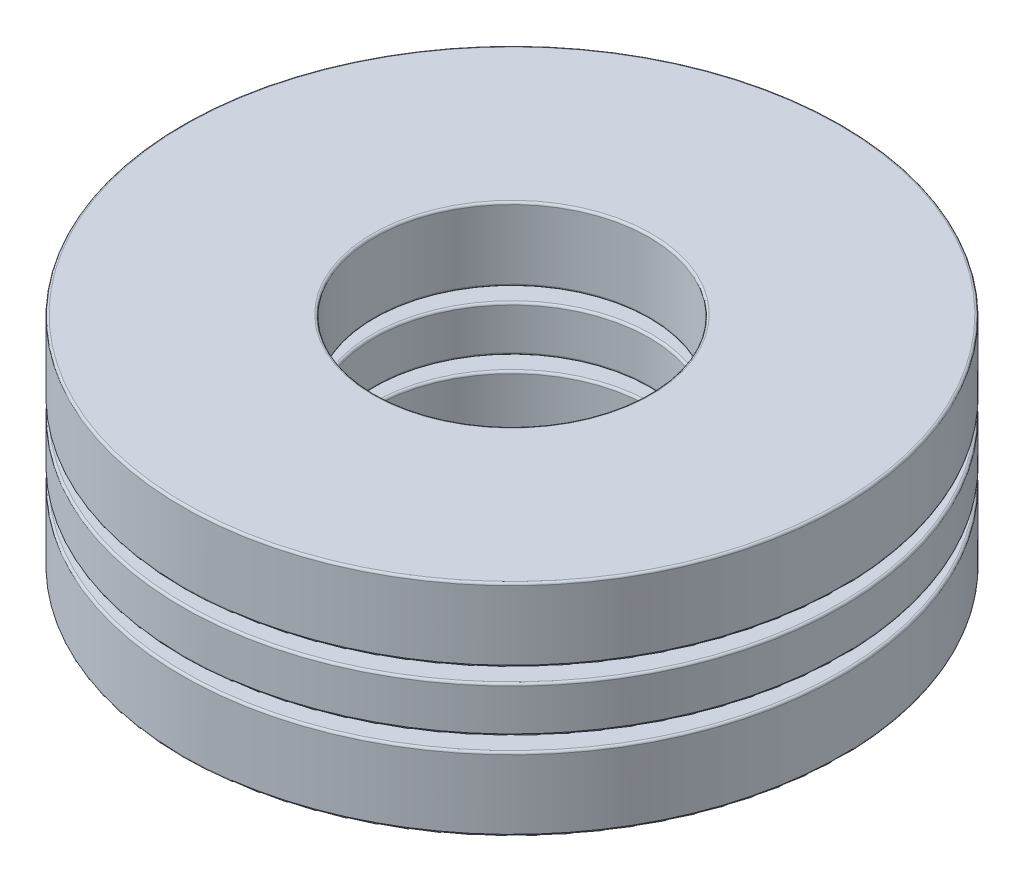
ISO-10303-21;
HEADER;
FILE_DESCRIPTION(('STEP AP214'),'2;1');
FILE_NAME('part.step','',(''),(''),'','','');
FILE_SCHEMA(('AUTOMOTIVE_DESIGN { 1 0 10303 214 1 1 1 1 }'));
ENDSEC;
DATA;
#1=APPLICATION_CONTEXT('core data for automotive mechanical design processes');
#2=APPLICATION_PROTOCOL_DEFINITION('international standard','automotive_design',2000,#1);
#3=PRODUCT_CONTEXT('',#1,'mechanical');
#4=PRODUCT('Part','Part','',(#3));
#5=PRODUCT_RELATED_PRODUCT_CATEGORY('part','',(#4));
#6=PRODUCT_DEFINITION_FORMATION('','',#4);
#7=PRODUCT_DEFINITION_CONTEXT('part definition',#1,'design');
#8=PRODUCT_DEFINITION('design','',#6,#7);
#9=PRODUCT_DEFINITION_SHAPE('','',#8);
#10=(LENGTH_UNIT() NAMED_UNIT(*) SI_UNIT(.MILLI.,.METRE.));
#11=(NAMED_UNIT(*) PLANE_ANGLE_UNIT() SI_UNIT($,.RADIAN.));
#12=(NAMED_UNIT(*) SI_UNIT($,.STERADIAN.) SOLID_ANGLE_UNIT());
#13=UNCERTAINTY_MEASURE_WITH_UNIT(LENGTH_MEASURE(1.E-05),#10,'distance_accuracy_value','');
#14=(GEOMETRIC_REPRESENTATION_CONTEXT(3) GLOBAL_UNCERTAINTY_ASSIGNED_CONTEXT((#13)) GLOBAL_UNIT_ASSIGNED_CONTEXT((#10,
#11,#12)) REPRESENTATION_CONTEXT('',''));
#15=CARTESIAN_POINT('',(0.,0.,0.));
#16=DIRECTION('',(0.,0.,1.));
#17=DIRECTION('',(1.,0.,0.));
#18=AXIS2_PLACEMENT_3D('',#15,#16,#17);
#19=CARTESIAN_POINT('',(0.,-2.,0.));
#20=DIRECTION('',(0.,-1.,0.));
#21=DIRECTION('',(0.,0.,-1.));
#22=AXIS2_PLACEMENT_3D('',#19,#20,#21);
#23=CYLINDRICAL_SURFACE('',#22,6.);
#24=CARTESIAN_POINT('',(0.,-1.96,0.));
#25=DIRECTION('',(0.,1.,0.));
#26=DIRECTION('',(0.,0.,1.));
#27=AXIS2_PLACEMENT_3D('',#24,#25,#26);
#28=CIRCLE('',#27,6.);
#29=CARTESIAN_POINT('',(0.,-1.96,6.));
#30=VERTEX_POINT('',#29);
#31=EDGE_CURVE('E11',#30,#30,#28,.T.);
#32=ORIENTED_EDGE('',*,*,#31,.T.);
#33=EDGE_LOOP('',(#32));
#34=FACE_BOUND('',#33,.T.);
#35=CARTESIAN_POINT('',(0.,-0.706666666666667,0.));
#36=DIRECTION('',(0.,-1.,0.));
#37=DIRECTION('',(0.,0.,-1.));
#38=AXIS2_PLACEMENT_3D('',#35,#36,#37);
#39=CIRCLE('',#38,6.);
#40=CARTESIAN_POINT('',(0.,-0.706666666666667,-6.));
#41=VERTEX_POINT('',#40);
#42=EDGE_CURVE('E50',#41,#41,#39,.T.);
#43=ORIENTED_EDGE('',*,*,#42,.T.);
#44=EDGE_LOOP('',(#43));
#45=FACE_BOUND('',#44,.T.);
#46=ADVANCED_FACE('F43',(#34,#45),#23,.T.);
#47=CARTESIAN_POINT('',(0.,-0.666666666666667,6.));
#48=DIRECTION('',(0.,-1.,0.));
#49=DIRECTION('',(0.,0.,-1.));
#50=AXIS2_PLACEMENT_3D('',#47,#48,#49);
#51=PLANE('',#50);
#52=CARTESIAN_POINT('',(0.,-0.666666666666667,0.));
#53=DIRECTION('',(0.,-1.,0.));
#54=DIRECTION('',(0.,0.,-1.));
#55=AXIS2_PLACEMENT_3D('',#52,#53,#54);
#56=CIRCLE('',#55,2.54);
#57=CARTESIAN_POINT('',(0.,-0.666666666666667,-2.54));
#58=VERTEX_POINT('',#57);
#59=EDGE_CURVE('E54',#58,#58,#56,.T.);
#60=ORIENTED_EDGE('',*,*,#59,.T.);
#61=EDGE_LOOP('',(#60));
#62=FACE_BOUND('',#61,.T.);
#63=CARTESIAN_POINT('',(0.,-0.666666666666667,0.));
#64=DIRECTION('',(0.,-1.,0.));
#65=DIRECTION('',(0.,0.,-1.));
#66=AXIS2_PLACEMENT_3D('',#63,#64,#65);
#67=CIRCLE('',#66,5.96);
#68=CARTESIAN_POINT('',(0.,-0.666666666666667,-5.96));
#69=VERTEX_POINT('',#68);
#70=EDGE_CURVE('E58',#69,#69,#67,.F.);
#71=ORIENTED_EDGE('',*,*,#70,.T.);
#72=EDGE_LOOP('',(#71));
#73=FACE_BOUND('',#72,.T.);
#74=ADVANCED_FACE('F86',(#62,#73),#51,.F.);
#75=CARTESIAN_POINT('',(0.,-2.,0.));
#76=DIRECTION('',(0.,-1.,0.));
#77=DIRECTION('',(0.,0.,-1.));
#78=AXIS2_PLACEMENT_3D('',#75,#76,#77);
#79=CYLINDRICAL_SURFACE('',#78,2.5);
#80=CARTESIAN_POINT('',(0.,-1.96,0.));
#81=DIRECTION('',(0.,1.,0.));
#82=DIRECTION('',(0.,0.,1.));
#83=AXIS2_PLACEMENT_3D('',#80,#81,#82);
#84=CIRCLE('',#83,2.5);
#85=CARTESIAN_POINT('',(0.,-1.96,2.5));
#86=VERTEX_POINT('',#85);
#87=EDGE_CURVE('E69',#86,#86,#84,.F.);
#88=ORIENTED_EDGE('',*,*,#87,.T.);
#89=EDGE_LOOP('',(#88));
#90=FACE_BOUND('',#89,.T.);
#91=CARTESIAN_POINT('',(0.,-0.706666666666667,0.));
#92=DIRECTION('',(0.,-1.,0.));
#93=DIRECTION('',(0.,0.,-1.));
#94=AXIS2_PLACEMENT_3D('',#91,#92,#93);
#95=CIRCLE('',#94,2.5);
#96=CARTESIAN_POINT('',(0.,-0.706666666666667,-2.5));
#97=VERTEX_POINT('',#96);
#98=EDGE_CURVE('E72',#97,#97,#95,.F.);
#99=ORIENTED_EDGE('',*,*,#98,.T.);
#100=EDGE_LOOP('',(#99));
#101=FACE_BOUND('',#100,.T.);
#102=ADVANCED_FACE('F76',(#90,#101),#79,.F.);
#103=CARTESIAN_POINT('',(0.,-2.,6.));
#104=DIRECTION('',(0.,1.,0.));
#105=DIRECTION('',(0.,0.,1.));
#106=AXIS2_PLACEMENT_3D('',#103,#104,#105);
#107=PLANE('',#106);
#108=CARTESIAN_POINT('',(0.,-2.,0.));
#109=DIRECTION('',(0.,1.,0.));
#110=DIRECTION('',(0.,0.,1.));
#111=AXIS2_PLACEMENT_3D('',#108,#109,#110);
#112=CIRCLE('',#111,2.54);
#113=CARTESIAN_POINT('',(0.,-2.,2.54));
#114=VERTEX_POINT('',#113);
#115=EDGE_CURVE('E63',#114,#114,#112,.T.);
#116=ORIENTED_EDGE('',*,*,#115,.T.);
#117=EDGE_LOOP('',(#116));
#118=FACE_BOUND('',#117,.T.);
#119=CARTESIAN_POINT('',(0.,-2.,0.));
#120=DIRECTION('',(0.,1.,0.));
#121=DIRECTION('',(0.,0.,1.));
#122=AXIS2_PLACEMENT_3D('',#119,#120,#121);
#123=CIRCLE('',#122,5.96);
#124=CARTESIAN_POINT('',(0.,-2.,5.96));
#125=VERTEX_POINT('',#124);
#126=EDGE_CURVE('E66',#125,#125,#123,.F.);
#127=ORIENTED_EDGE('',*,*,#126,.T.);
#128=EDGE_LOOP('',(#127));
#129=FACE_BOUND('',#128,.T.);
#130=ADVANCED_FACE('F105',(#118,#129),#107,.F.);
#131=CARTESIAN_POINT('',(0.,-1.96,0.));
#132=DIRECTION('',(0.,1.,0.));
#133=DIRECTION('',(0.,0.,1.));
#134=AXIS2_PLACEMENT_3D('',#131,#132,#133);
#135=TOROIDAL_SURFACE('',#134,2.54,0.04);
#136=ORIENTED_EDGE('',*,*,#115,.F.);
#137=EDGE_LOOP('',(#136));
#138=FACE_BOUND('',#137,.T.);
#139=ORIENTED_EDGE('',*,*,#87,.F.);
#140=EDGE_LOOP('',(#139));
#141=FACE_BOUND('',#140,.T.);
#142=ADVANCED_FACE('F82',(#138,#141),#135,.T.);
#143=CARTESIAN_POINT('',(0.,-0.706666666666667,0.));
#144=DIRECTION('',(0.,-1.,0.));
#145=DIRECTION('',(0.,0.,-1.));
#146=AXIS2_PLACEMENT_3D('',#143,#144,#145);
#147=TOROIDAL_SURFACE('',#146,2.54,0.04);
#148=ORIENTED_EDGE('',*,*,#98,.F.);
#149=EDGE_LOOP('',(#148));
#150=FACE_BOUND('',#149,.T.);
#151=ORIENTED_EDGE('',*,*,#59,.F.);
#152=EDGE_LOOP('',(#151));
#153=FACE_BOUND('',#152,.T.);
#154=ADVANCED_FACE('F78',(#150,#153),#147,.T.);
#155=CARTESIAN_POINT('',(0.,-1.96,0.));
#156=DIRECTION('',(0.,1.,0.));
#157=DIRECTION('',(0.,0.,1.));
#158=AXIS2_PLACEMENT_3D('',#155,#156,#157);
#159=TOROIDAL_SURFACE('',#158,5.96,0.04);
#160=ORIENTED_EDGE('',*,*,#31,.F.);
#161=EDGE_LOOP('',(#160));
#162=FACE_BOUND('',#161,.T.);
#163=ORIENTED_EDGE('',*,*,#126,.F.);
#164=EDGE_LOOP('',(#163));
#165=FACE_BOUND('',#164,.T.);
#166=ADVANCED_FACE('F81',(#162,#165),#159,.T.);
#167=CARTESIAN_POINT('',(0.,-0.706666666666667,0.));
#168=DIRECTION('',(0.,-1.,0.));
#169=DIRECTION('',(0.,0.,-1.));
#170=AXIS2_PLACEMENT_3D('',#167,#168,#169);
#171=TOROIDAL_SURFACE('',#170,5.96,0.04);
#172=ORIENTED_EDGE('',*,*,#70,.F.);
#173=EDGE_LOOP('',(#172));
#174=FACE_BOUND('',#173,.T.);
#175=ORIENTED_EDGE('',*,*,#42,.F.);
#176=EDGE_LOOP('',(#175));
#177=FACE_BOUND('',#176,.T.);
#178=ADVANCED_FACE('F45',(#174,#177),#171,.T.);
#179=CLOSED_SHELL('',(#46,#74,#102,#130,#142,#154,#166,#178));
#180=MANIFOLD_SOLID_BREP('B2',#179);
#181=CARTESIAN_POINT('',(0.,-2.,0.));
#182=DIRECTION('',(0.,-1.,0.));
#183=DIRECTION('',(0.,0.,-1.));
#184=AXIS2_PLACEMENT_3D('',#181,#182,#183);
#185=CYLINDRICAL_SURFACE('',#184,6.);
#186=CARTESIAN_POINT('',(0.,0.706666666666668,0.));
#187=DIRECTION('',(0.,1.,0.));
#188=DIRECTION('',(0.,0.,1.));
#189=AXIS2_PLACEMENT_3D('',#186,#187,#188);
#190=CIRCLE('',#189,6.);
#191=CARTESIAN_POINT('',(0.,0.706666666666668,6.));
#192=VERTEX_POINT('',#191);
#193=EDGE_CURVE('E42',#192,#192,#190,.T.);
#194=ORIENTED_EDGE('',*,*,#193,.T.);
#195=EDGE_LOOP('',(#194));
#196=FACE_BOUND('',#195,.T.);
#197=CARTESIAN_POINT('',(0.,1.96,0.));
#198=DIRECTION('',(0.,-1.,0.));
#199=DIRECTION('',(0.,0.,-1.));
#200=AXIS2_PLACEMENT_3D('',#197,#198,#199);
#201=CIRCLE('',#200,6.);
#202=CARTESIAN_POINT('',(0.,1.96,-6.));
#203=VERTEX_POINT('',#202);
#204=EDGE_CURVE('E177',#203,#203,#201,.T.);
#205=ORIENTED_EDGE('',*,*,#204,.T.);
#206=EDGE_LOOP('',(#205));
#207=FACE_BOUND('',#206,.T.);
#208=ADVANCED_FACE('F170',(#196,#207),#185,.T.);
#209=CARTESIAN_POINT('',(0.,2.,6.));
#210=DIRECTION('',(0.,-1.,0.));
#211=DIRECTION('',(0.,0.,-1.));
#212=AXIS2_PLACEMENT_3D('',#209,#210,#211);
#213=PLANE('',#212);
#214=CARTESIAN_POINT('',(0.,2.,0.));
#215=DIRECTION('',(0.,-1.,0.));
#216=DIRECTION('',(0.,0.,-1.));
#217=AXIS2_PLACEMENT_3D('',#214,#215,#216);
#218=CIRCLE('',#217,2.54);
#219=CARTESIAN_POINT('',(0.,2.,-2.54));
#220=VERTEX_POINT('',#219);
#221=EDGE_CURVE('E181',#220,#220,#218,.T.);
#222=ORIENTED_EDGE('',*,*,#221,.T.);
#223=EDGE_LOOP('',(#222));
#224=FACE_BOUND('',#223,.T.);
#225=CARTESIAN_POINT('',(0.,2.,0.));
#226=DIRECTION('',(0.,-1.,0.));
#227=DIRECTION('',(0.,0.,-1.));
#228=AXIS2_PLACEMENT_3D('',#225,#226,#227);
#229=CIRCLE('',#228,5.96);
#230=CARTESIAN_POINT('',(0.,2.,-5.96));
#231=VERTEX_POINT('',#230);
#232=EDGE_CURVE('E185',#231,#231,#229,.F.);
#233=ORIENTED_EDGE('',*,*,#232,.T.);
#234=EDGE_LOOP('',(#233));
#235=FACE_BOUND('',#234,.T.);
#236=ADVANCED_FACE('F213',(#224,#235),#213,.F.);
#237=CARTESIAN_POINT('',(0.,-2.,0.));
#238=DIRECTION('',(0.,-1.,0.));
#239=DIRECTION('',(0.,0.,-1.));
#240=AXIS2_PLACEMENT_3D('',#237,#238,#239);
#241=CYLINDRICAL_SURFACE('',#240,2.5);
#242=CARTESIAN_POINT('',(0.,0.706666666666668,0.));
#243=DIRECTION('',(0.,1.,0.));
#244=DIRECTION('',(0.,0.,1.));
#245=AXIS2_PLACEMENT_3D('',#242,#243,#244);
#246=CIRCLE('',#245,2.5);
#247=CARTESIAN_POINT('',(0.,0.706666666666668,2.5));
#248=VERTEX_POINT('',#247);
#249=EDGE_CURVE('E196',#248,#248,#246,.F.);
#250=ORIENTED_EDGE('',*,*,#249,.T.);
#251=EDGE_LOOP('',(#250));
#252=FACE_BOUND('',#251,.T.);
#253=CARTESIAN_POINT('',(0.,1.96,0.));
#254=DIRECTION('',(0.,-1.,0.));
#255=DIRECTION('',(0.,0.,-1.));
#256=AXIS2_PLACEMENT_3D('',#253,#254,#255);
#257=CIRCLE('',#256,2.5);
#258=CARTESIAN_POINT('',(0.,1.96,-2.5));
#259=VERTEX_POINT('',#258);
#260=EDGE_CURVE('E199',#259,#259,#257,.F.);
#261=ORIENTED_EDGE('',*,*,#260,.T.);
#262=EDGE_LOOP('',(#261));
#263=FACE_BOUND('',#262,.T.);
#264=ADVANCED_FACE('F203',(#252,#263),#241,.F.);
#265=CARTESIAN_POINT('',(0.,0.666666666666668,6.));
#266=DIRECTION('',(0.,1.,0.));
#267=DIRECTION('',(0.,0.,1.));
#268=AXIS2_PLACEMENT_3D('',#265,#266,#267);
#269=PLANE('',#268);
#270=CARTESIAN_POINT('',(0.,0.666666666666668,0.));
#271=DIRECTION('',(0.,1.,0.));
#272=DIRECTION('',(0.,0.,1.));
#273=AXIS2_PLACEMENT_3D('',#270,#271,#272);
#274=CIRCLE('',#273,2.54);
#275=CARTESIAN_POINT('',(0.,0.666666666666668,2.54));
#276=VERTEX_POINT('',#275);
#277=EDGE_CURVE('E190',#276,#276,#274,.T.);
#278=ORIENTED_EDGE('',*,*,#277,.T.);
#279=EDGE_LOOP('',(#278));
#280=FACE_BOUND('',#279,.T.);
#281=CARTESIAN_POINT('',(0.,0.666666666666668,0.));
#282=DIRECTION('',(0.,1.,0.));
#283=DIRECTION('',(0.,0.,1.));
#284=AXIS2_PLACEMENT_3D('',#281,#282,#283);
#285=CIRCLE('',#284,5.96);
#286=CARTESIAN_POINT('',(0.,0.666666666666668,5.96));
#287=VERTEX_POINT('',#286);
#288=EDGE_CURVE('E193',#287,#287,#285,.F.);
#289=ORIENTED_EDGE('',*,*,#288,.T.);
#290=EDGE_LOOP('',(#289));
#291=FACE_BOUND('',#290,.T.);
#292=ADVANCED_FACE('F232',(#280,#291),#269,.F.);
#293=CARTESIAN_POINT('',(0.,0.706666666666668,0.));
#294=DIRECTION('',(0.,1.,0.));
#295=DIRECTION('',(0.,0.,1.));
#296=AXIS2_PLACEMENT_3D('',#293,#294,#295);
#297=TOROIDAL_SURFACE('',#296,2.54,0.04);
#298=ORIENTED_EDGE('',*,*,#277,.F.);
#299=EDGE_LOOP('',(#298));
#300=FACE_BOUND('',#299,.T.);
#301=ORIENTED_EDGE('',*,*,#249,.F.);
#302=EDGE_LOOP('',(#301));
#303=FACE_BOUND('',#302,.T.);
#304=ADVANCED_FACE('F209',(#300,#303),#297,.T.);
#305=CARTESIAN_POINT('',(0.,1.96,0.));
#306=DIRECTION('',(0.,-1.,0.));
#307=DIRECTION('',(0.,0.,-1.));
#308=AXIS2_PLACEMENT_3D('',#305,#306,#307);
#309=TOROIDAL_SURFACE('',#308,2.54,0.04);
#310=ORIENTED_EDGE('',*,*,#260,.F.);
#311=EDGE_LOOP('',(#310));
#312=FACE_BOUND('',#311,.T.);
#313=ORIENTED_EDGE('',*,*,#221,.F.);
#314=EDGE_LOOP('',(#313));
#315=FACE_BOUND('',#314,.T.);
#316=ADVANCED_FACE('F205',(#312,#315),#309,.T.);
#317=CARTESIAN_POINT('',(0.,0.706666666666668,0.));
#318=DIRECTION('',(0.,1.,0.));
#319=DIRECTION('',(0.,0.,1.));
#320=AXIS2_PLACEMENT_3D('',#317,#318,#319);
#321=TOROIDAL_SURFACE('',#320,5.96,0.04);
#322=ORIENTED_EDGE('',*,*,#193,.F.);
#323=EDGE_LOOP('',(#322));
#324=FACE_BOUND('',#323,.T.);
#325=ORIENTED_EDGE('',*,*,#288,.F.);
#326=EDGE_LOOP('',(#325));
#327=FACE_BOUND('',#326,.T.);
#328=ADVANCED_FACE('F208',(#324,#327),#321,.T.);
#329=CARTESIAN_POINT('',(0.,1.96,0.));
#330=DIRECTION('',(0.,-1.,0.));
#331=DIRECTION('',(0.,0.,-1.));
#332=AXIS2_PLACEMENT_3D('',#329,#330,#331);
#333=TOROIDAL_SURFACE('',#332,5.96,0.04);
#334=ORIENTED_EDGE('',*,*,#232,.F.);
#335=EDGE_LOOP('',(#334));
#336=FACE_BOUND('',#335,.T.);
#337=ORIENTED_EDGE('',*,*,#204,.F.);
#338=EDGE_LOOP('',(#337));
#339=FACE_BOUND('',#338,.T.);
#340=ADVANCED_FACE('F172',(#336,#339),#333,.T.);
#341=CLOSED_SHELL('',(#208,#236,#264,#292,#304,#316,#328,#340));
#342=MANIFOLD_SOLID_BREP('B6',#341);
#343=CARTESIAN_POINT('',(-3.68060796608388,0.,-2.12499999999997));
#344=DIRECTION('',(0.,1.,0.));
#345=DIRECTION('',(0.866025403784443,0.,0.499999999999992));
#346=AXIS2_PLACEMENT_3D('',#343,#344,#345);
#347=SPHERICAL_SURFACE('',#346,0.666666666666667);
#348=CARTESIAN_POINT('',(-3.68060796608388,0.666666666666667,-2.12499999999997));
#349=VERTEX_POINT('',#348);
#350=VERTEX_LOOP('',#349);
#351=FACE_BOUND('',#350,.T.);
#352=ADVANCED_FACE('F297',(#351),#347,.T.);
#353=CLOSED_SHELL('',(#352));
#354=MANIFOLD_SOLID_BREP('B37',#353);
#355=CARTESIAN_POINT('',(3.68060796608386,0.,-2.12500000000002));
#356=DIRECTION('',(0.,1.,0.));
#357=DIRECTION('',(-0.866025403784436,0.,0.500000000000004));
#358=AXIS2_PLACEMENT_3D('',#355,#356,#357);
#359=SPHERICAL_SURFACE('',#358,0.666666666666667);
#360=CARTESIAN_POINT('',(3.68060796608386,0.666666666666667,-2.12500000000002));
#361=VERTEX_POINT('',#360);
#362=VERTEX_LOOP('',#361);
#363=FACE_BOUND('',#362,.T.);
#364=ADVANCED_FACE('F315',(#363),#359,.T.);
#365=CLOSED_SHELL('',(#364));
#366=MANIFOLD_SOLID_BREP('B166',#365);
#367=CARTESIAN_POINT('',(0.,0.,4.25));
#368=DIRECTION('',(0.,1.,0.));
#369=DIRECTION('',(0.,0.,-1.));
#370=AXIS2_PLACEMENT_3D('',#367,#368,#369);
#371=SPHERICAL_SURFACE('',#370,0.666666666666667);
#372=CARTESIAN_POINT('',(0.,0.666666666666667,4.25));
#373=VERTEX_POINT('',#372);
#374=VERTEX_LOOP('',#373);
#375=FACE_BOUND('',#374,.T.);
#376=ADVANCED_FACE('F334',(#375),#371,.T.);
#377=CLOSED_SHELL('',(#376));
#378=MANIFOLD_SOLID_BREP('B293',#377);
#379=CARTESIAN_POINT('',(0.,-2.,0.));
#380=DIRECTION('',(0.,-1.,0.));
#381=DIRECTION('',(0.,0.,-1.));
#382=AXIS2_PLACEMENT_3D('',#379,#380,#381);
#383=CYLINDRICAL_SURFACE('',#382,6.);
#384=CARTESIAN_POINT('',(0.,-0.376666666666667,0.));
#385=DIRECTION('',(0.,1.,0.));
#386=DIRECTION('',(0.,0.,1.));
#387=AXIS2_PLACEMENT_3D('',#384,#385,#386);
#388=CIRCLE('',#387,6.);
#389=CARTESIAN_POINT('',(0.,-0.376666666666667,6.));
#390=VERTEX_POINT('',#389);
#391=EDGE_CURVE('E333',#390,#390,#388,.T.);
#392=ORIENTED_EDGE('',*,*,#391,.T.);
#393=EDGE_LOOP('',(#392));
#394=FACE_BOUND('',#393,.T.);
#395=CARTESIAN_POINT('',(0.,0.376666666666666,0.));
#396=DIRECTION('',(0.,-1.,0.));
#397=DIRECTION('',(0.,0.,-1.));
#398=AXIS2_PLACEMENT_3D('',#395,#396,#397);
#399=CIRCLE('',#398,6.);
#400=CARTESIAN_POINT('',(0.,0.376666666666666,-6.));
#401=VERTEX_POINT('',#400);
#402=EDGE_CURVE('E353',#401,#401,#399,.T.);
#403=ORIENTED_EDGE('',*,*,#402,.T.);
#404=EDGE_LOOP('',(#403));
#405=FACE_BOUND('',#404,.T.);
#406=ADVANCED_FACE('F346',(#394,#405),#383,.T.);
#407=CARTESIAN_POINT('',(0.,-0.416666666666667,6.));
#408=DIRECTION('',(0.,1.,0.));
#409=DIRECTION('',(0.,0.,1.));
#410=AXIS2_PLACEMENT_3D('',#407,#408,#409);
#411=PLANE('',#410);
#412=CARTESIAN_POINT('',(0.,-0.416666666666667,0.));
#413=DIRECTION('',(0.,1.,0.));
#414=DIRECTION('',(0.,0.,1.));
#415=AXIS2_PLACEMENT_3D('',#412,#413,#414);
#416=CIRCLE('',#415,2.54);
#417=CARTESIAN_POINT('',(0.,-0.416666666666667,2.54));
#418=VERTEX_POINT('',#417);
#419=EDGE_CURVE('E366',#418,#418,#416,.T.);
#420=ORIENTED_EDGE('',*,*,#419,.T.);
#421=EDGE_LOOP('',(#420));
#422=FACE_BOUND('',#421,.T.);
#423=CARTESIAN_POINT('',(0.,-0.416666666666667,0.));
#424=DIRECTION('',(0.,1.,0.));
#425=DIRECTION('',(0.,0.,1.));
#426=AXIS2_PLACEMENT_3D('',#423,#424,#425);
#427=CIRCLE('',#426,5.96);
#428=CARTESIAN_POINT('',(0.,-0.416666666666667,5.96));
#429=VERTEX_POINT('',#428);
#430=EDGE_CURVE('E369',#429,#429,#427,.F.);
#431=ORIENTED_EDGE('',*,*,#430,.T.);
#432=EDGE_LOOP('',(#431));
#433=FACE_BOUND('',#432,.T.);
#434=CARTESIAN_POINT('',(-3.68060796608388,-0.416666666666667,-2.12499999999997));
#435=DIRECTION('',(0.,1.,0.));
#436=DIRECTION('',(-0.866025403784443,0.,-0.499999999999992));
#437=AXIS2_PLACEMENT_3D('',#434,#435,#436);
#438=CIRCLE('',#437,0.520416499866533);
#439=CARTESIAN_POINT('',(-3.22991405665088,-0.416666666666667,-1.8647917500667));
#440=VERTEX_POINT('',#439);
#441=EDGE_CURVE('E390',#440,#440,#438,.T.);
#442=ORIENTED_EDGE('',*,*,#441,.T.);
#443=EDGE_LOOP('',(#442));
#444=FACE_BOUND('',#443,.T.);
#445=CARTESIAN_POINT('',(3.68060796608386,-0.416666666666667,-2.12500000000002));
#446=DIRECTION('',(0.,1.,0.));
#447=DIRECTION('',(0.866025403784436,0.,-0.500000000000004));
#448=AXIS2_PLACEMENT_3D('',#445,#446,#447);
#449=CIRCLE('',#448,0.520416499866533);
#450=CARTESIAN_POINT('',(3.22991405665086,-0.416666666666667,-1.86479175006675));
#451=VERTEX_POINT('',#450);
#452=EDGE_CURVE('E382',#451,#451,#449,.T.);
#453=ORIENTED_EDGE('',*,*,#452,.T.);
#454=EDGE_LOOP('',(#453));
#455=FACE_BOUND('',#454,.T.);
#456=CARTESIAN_POINT('',(0.,-0.416666666666667,4.25));
#457=DIRECTION('',(0.,1.,0.));
#458=DIRECTION('',(0.,0.,1.));
#459=AXIS2_PLACEMENT_3D('',#456,#457,#458);
#460=CIRCLE('',#459,0.520416499866533);
#461=CARTESIAN_POINT('',(0.,-0.416666666666667,3.72958350013347));
#462=VERTEX_POINT('',#461);
#463=EDGE_CURVE('E378',#462,#462,#460,.T.);
#464=ORIENTED_EDGE('',*,*,#463,.T.);
#465=EDGE_LOOP('',(#464));
#466=FACE_BOUND('',#465,.T.);
#467=ADVANCED_FACE('F408',(#422,#433,#444,#455,#466),#411,.F.);
#468=CARTESIAN_POINT('',(0.,-2.,0.));
#469=DIRECTION('',(0.,-1.,0.));
#470=DIRECTION('',(0.,0.,-1.));
#471=AXIS2_PLACEMENT_3D('',#468,#469,#470);
#472=CYLINDRICAL_SURFACE('',#471,2.5);
#473=CARTESIAN_POINT('',(0.,-0.376666666666667,0.));
#474=DIRECTION('',(0.,1.,0.));
#475=DIRECTION('',(0.,0.,1.));
#476=AXIS2_PLACEMENT_3D('',#473,#474,#475);
#477=CIRCLE('',#476,2.5);
#478=CARTESIAN_POINT('',(0.,-0.376666666666667,2.5));
#479=VERTEX_POINT('',#478);
#480=EDGE_CURVE('E372',#479,#479,#477,.F.);
#481=ORIENTED_EDGE('',*,*,#480,.T.);
#482=EDGE_LOOP('',(#481));
#483=FACE_BOUND('',#482,.T.);
#484=CARTESIAN_POINT('',(0.,0.376666666666666,0.));
#485=DIRECTION('',(0.,-1.,0.));
#486=DIRECTION('',(0.,0.,-1.));
#487=AXIS2_PLACEMENT_3D('',#484,#485,#486);
#488=CIRCLE('',#487,2.5);
#489=CARTESIAN_POINT('',(0.,0.376666666666666,-2.5));
#490=VERTEX_POINT('',#489);
#491=EDGE_CURVE('E375',#490,#490,#488,.F.);
#492=ORIENTED_EDGE('',*,*,#491,.T.);
#493=EDGE_LOOP('',(#492));
#494=FACE_BOUND('',#493,.T.);
#495=ADVANCED_FACE('F411',(#483,#494),#472,.F.);
#496=CARTESIAN_POINT('',(0.,0.416666666666666,6.));
#497=DIRECTION('',(0.,-1.,0.));
#498=DIRECTION('',(0.,0.,-1.));
#499=AXIS2_PLACEMENT_3D('',#496,#497,#498);
#500=PLANE('',#499);
#501=CARTESIAN_POINT('',(0.,0.416666666666666,0.));
#502=DIRECTION('',(0.,-1.,0.));
#503=DIRECTION('',(0.,0.,-1.));
#504=AXIS2_PLACEMENT_3D('',#501,#502,#503);
#505=CIRCLE('',#504,2.54);
#506=CARTESIAN_POINT('',(0.,0.416666666666666,-2.54));
#507=VERTEX_POINT('',#506);
#508=EDGE_CURVE('E357',#507,#507,#505,.T.);
#509=ORIENTED_EDGE('',*,*,#508,.T.);
#510=EDGE_LOOP('',(#509));
#511=FACE_BOUND('',#510,.T.);
#512=CARTESIAN_POINT('',(0.,0.416666666666666,0.));
#513=DIRECTION('',(0.,-1.,0.));
#514=DIRECTION('',(0.,0.,-1.));
#515=AXIS2_PLACEMENT_3D('',#512,#513,#514);
#516=CIRCLE('',#515,5.96);
#517=CARTESIAN_POINT('',(0.,0.416666666666666,-5.96));
#518=VERTEX_POINT('',#517);
#519=EDGE_CURVE('E361',#518,#518,#516,.F.);
#520=ORIENTED_EDGE('',*,*,#519,.T.);
#521=EDGE_LOOP('',(#520));
#522=FACE_BOUND('',#521,.T.);
#523=CARTESIAN_POINT('',(-3.68060796608388,0.416666666666666,-2.12499999999997));
#524=DIRECTION('',(0.,-1.,0.));
#525=DIRECTION('',(0.866025403784443,0.,0.499999999999992));
#526=AXIS2_PLACEMENT_3D('',#523,#524,#525);
#527=CIRCLE('',#526,0.520416499866534);
#528=CARTESIAN_POINT('',(-3.22991405665088,0.416666666666666,-1.8647917500667));
#529=VERTEX_POINT('',#528);
#530=EDGE_CURVE('E393',#529,#529,#527,.T.);
#531=ORIENTED_EDGE('',*,*,#530,.T.);
#532=EDGE_LOOP('',(#531));
#533=FACE_BOUND('',#532,.T.);
#534=CARTESIAN_POINT('',(3.68060796608386,0.416666666666666,-2.12500000000002));
#535=DIRECTION('',(0.,-1.,0.));
#536=DIRECTION('',(-0.866025403784436,0.,0.500000000000004));
#537=AXIS2_PLACEMENT_3D('',#534,#535,#536);
#538=CIRCLE('',#537,0.520416499866534);
#539=CARTESIAN_POINT('',(3.22991405665086,0.416666666666666,-1.86479175006675));
#540=VERTEX_POINT('',#539);
#541=EDGE_CURVE('E387',#540,#540,#538,.T.);
#542=ORIENTED_EDGE('',*,*,#541,.T.);
#543=EDGE_LOOP('',(#542));
#544=FACE_BOUND('',#543,.T.);
#545=CARTESIAN_POINT('',(0.,0.416666666666666,4.25));
#546=DIRECTION('',(0.,-1.,0.));
#547=DIRECTION('',(0.,0.,-1.));
#548=AXIS2_PLACEMENT_3D('',#545,#546,#547);
#549=CIRCLE('',#548,0.520416499866534);
#550=CARTESIAN_POINT('',(0.,0.416666666666666,3.72958350013347));
#551=VERTEX_POINT('',#550);
#552=EDGE_CURVE('E379',#551,#551,#549,.T.);
#553=ORIENTED_EDGE('',*,*,#552,.T.);
#554=EDGE_LOOP('',(#553));
#555=FACE_BOUND('',#554,.T.);
#556=ADVANCED_FACE('F397',(#511,#522,#533,#544,#555),#500,.F.);
#557=CARTESIAN_POINT('',(0.,0.,4.25));
#558=DIRECTION('',(0.,1.,0.));
#559=DIRECTION('',(0.,0.,-1.));
#560=AXIS2_PLACEMENT_3D('',#557,#558,#559);
#561=SPHERICAL_SURFACE('',#560,0.666666666666667);
#562=CARTESIAN_POINT('',(0.,0.416666666666666,3.72958350013347));
#563=CARTESIAN_POINT('',(0.,0.409346958507249,3.72372288146706));
#564=CARTESIAN_POINT('',(0.,0.401903458039978,3.71801689413085));
#565=CARTESIAN_POINT('',(0.,0.386782452064309,3.70692389216009));
#566=CARTESIAN_POINT('',(0.,0.379104946555911,3.70153687752555));
#567=CARTESIAN_POINT('',(0.,0.363529510072567,3.69109153099944));
#568=CARTESIAN_POINT('',(0.,0.35563157909762,3.68603319910787));
#569=CARTESIAN_POINT('',(0.,0.339629375282478,3.67625419083093));
#570=CARTESIAN_POINT('',(0.,0.331525102442282,3.67153351444556));
#571=CARTESIAN_POINT('',(0.,0.315124635921715,3.66243822961398));
#572=CARTESIAN_POINT('',(0.,0.306828442241346,3.65806362116779));
#573=CARTESIAN_POINT('',(0.,0.290058904739913,3.64966825764829));
#574=CARTESIAN_POINT('',(0.,0.28158556091885,3.64564750257499));
#575=CARTESIAN_POINT('',(0.,0.264476807053422,3.63796700422712));
#576=CARTESIAN_POINT('',(0.,0.255841397009057,3.63430726095255));
#577=CARTESIAN_POINT('',(0.,0.238423883702476,3.62735530116514));
#578=CARTESIAN_POINT('',(0.,0.22964178044026,3.62406308465232));
#579=CARTESIAN_POINT('',(0.,0.211946514694673,3.61785203928502));
#580=CARTESIAN_POINT('',(0.,0.203033352211303,3.61493321043056));
#581=CARTESIAN_POINT('',(0.,0.18509183537497,3.60947413651012));
#582=CARTESIAN_POINT('',(0.,0.176063481022006,3.60693389144415));
#583=CARTESIAN_POINT('',(0.,0.157907652853236,3.60223650728547));
#584=CARTESIAN_POINT('',(0.,0.148780179037429,3.60007936819276));
#585=CARTESIAN_POINT('',(0.,0.130442360806612,3.59615203615047));
#586=CARTESIAN_POINT('',(0.,0.121232016391602,3.59438184320089));
#587=CARTESIAN_POINT('',(0.,0.102744853352682,3.59123155476859));
#588=CARTESIAN_POINT('',(0.,0.0934680347287729,3.58985145928587));
#589=CARTESIAN_POINT('',(0.,0.0748644380009357,3.58748382265348));
#590=CARTESIAN_POINT('',(0.,0.0655376598970077,3.58649628150381));
#591=CARTESIAN_POINT('',(0.,0.046850747876557,3.58491551157281));
#592=CARTESIAN_POINT('',(0.,0.0374906139600342,3.58432228279148));
#593=CARTESIAN_POINT('',(0.,0.0187536533623407,3.58353119367174));
#594=CARTESIAN_POINT('',(0.,0.00937682668116993,3.58333333333333));
#595=CARTESIAN_POINT('',(0.,-0.00937682668117156,3.58333333333333));
#596=CARTESIAN_POINT('',(0.,-0.0187536533623423,3.58353119367174));
#597=CARTESIAN_POINT('',(0.,-0.0374906139600358,3.58432228279148));
#598=CARTESIAN_POINT('',(0.,-0.0468507478765586,3.58491551157281));
#599=CARTESIAN_POINT('',(0.,-0.0655376598970093,3.58649628150381));
#600=CARTESIAN_POINT('',(0.,-0.0748644380009373,3.58748382265348));
#601=CARTESIAN_POINT('',(0.,-0.0934680347287745,3.58985145928587));
#602=CARTESIAN_POINT('',(0.,-0.102744853352684,3.59123155476859));
#603=CARTESIAN_POINT('',(0.,-0.121232016391603,3.59438184320089));
#604=CARTESIAN_POINT('',(0.,-0.130442360806613,3.59615203615047));
#605=CARTESIAN_POINT('',(0.,-0.14878017903743,3.60007936819276));
#606=CARTESIAN_POINT('',(0.,-0.157907652853237,3.60223650728547));
#607=CARTESIAN_POINT('',(0.,-0.176063481022008,3.60693389144415));
#608=CARTESIAN_POINT('',(0.,-0.185091835374971,3.60947413651013));
#609=CARTESIAN_POINT('',(0.,-0.203033352211305,3.61493321043056));
#610=CARTESIAN_POINT('',(0.,-0.211946514694675,3.61785203928502));
#611=CARTESIAN_POINT('',(0.,-0.229641780440261,3.62406308465232));
#612=CARTESIAN_POINT('',(0.,-0.238423883702478,3.62735530116515));
#613=CARTESIAN_POINT('',(0.,-0.255841397009059,3.63430726095255));
#614=CARTESIAN_POINT('',(0.,-0.264476807053424,3.63796700422712));
#615=CARTESIAN_POINT('',(0.,-0.281585560918852,3.64564750257499));
#616=CARTESIAN_POINT('',(0.,-0.290058904739914,3.64966825764829));
#617=CARTESIAN_POINT('',(0.,-0.306828442241347,3.65806362116779));
#618=CARTESIAN_POINT('',(0.,-0.315124635921717,3.66243822961398));
#619=CARTESIAN_POINT('',(0.,-0.331525102442283,3.67153351444556));
#620=CARTESIAN_POINT('',(0.,-0.339629375282479,3.67625419083093));
#621=CARTESIAN_POINT('',(0.,-0.355631579097622,3.68603319910788));
#622=CARTESIAN_POINT('',(0.,-0.363529510072568,3.69109153099944));
#623=CARTESIAN_POINT('',(0.,-0.379104946555912,3.70153687752555));
#624=CARTESIAN_POINT('',(0.,-0.386782452064311,3.70692389216009));
#625=CARTESIAN_POINT('',(0.,-0.401903458039979,3.71801689413085));
#626=CARTESIAN_POINT('',(0.,-0.40934695850725,3.72372288146707));
#627=CARTESIAN_POINT('',(0.,-0.416666666666667,3.72958350013347));
#628=B_SPLINE_CURVE_WITH_KNOTS('',3,(#562,#563,#564,#565,#566,#567,#568,#569,#570,#571,#572,
#573,#574,#575,#576,#577,#578,#579,#580,#581,#582,#583,#584,#585,#586,#587,#588,#589,#590,#591,
#592,#593,#594,#595,#596,#597,#598,#599,#600,#601,#602,#603,#604,#605,#606,#607,#608,#609,#610,
#611,#612,#613,#614,#615,#616,#617,#618,#619,#620,#621,#622,#623,#624,#625,#626,#627),
.UNSPECIFIED.,.F.,.F.,(4,2,2,2,2,2,2,2,2,2,2,2,2,2,2,2,2,2,2,2,2,2,2,2,2,2,2,2,2,2,2,2,4),(0.,
0.0281283936802482,0.0562567873604966,0.0843851810407448,0.112513574720993,0.140641968401241,
0.16877036208149,0.196898755761738,0.225027149441986,0.253155543122235,0.281283936802483,
0.309412330482731,0.337540724162979,0.365669117843228,0.393797511523476,0.421925905203724,
0.450054298883973,0.478182692564221,0.506311086244469,0.534439479924718,0.562567873604966,
0.590696267285214,0.618824660965462,0.646953054645711,0.675081448325959,0.703209842006207,
0.731338235686456,0.759466629366704,0.787595023046952,0.8157234167272,0.843851810407449,
0.871980204087697,0.900108597767945),.UNSPECIFIED.);
#629=EDGE_CURVE('BSEAM418',#551,#462,#628,.T.);
#630=ORIENTED_EDGE('',*,*,#552,.F.);
#631=ORIENTED_EDGE('',*,*,#463,.F.);
#632=ORIENTED_EDGE('',*,*,#629,.T.);
#633=ORIENTED_EDGE('',*,*,#629,.F.);
#634=EDGE_LOOP('',(#630,#632,#631,#633));
#635=FACE_BOUND('',#634,.T.);
#636=ADVANCED_FACE('F418',(#635),#561,.F.);
#637=CARTESIAN_POINT('',(3.68060796608386,0.,-2.12500000000002));
#638=DIRECTION('',(0.,1.,0.));
#639=DIRECTION('',(-0.866025403784436,0.,0.500000000000004));
#640=AXIS2_PLACEMENT_3D('',#637,#638,#639);
#641=SPHERICAL_SURFACE('',#640,0.666666666666667);
#642=CARTESIAN_POINT('',(3.22991405665086,0.416666666666666,-1.86479175006675));
#643=CARTESIAN_POINT('',(3.22483861200386,0.409346958507249,-1.86186144073355));
#644=CARTESIAN_POINT('',(3.21989708201702,0.401903458039978,-1.85900844706544));
#645=CARTESIAN_POINT('',(3.21029026050612,0.386782452064309,-1.85346194608006));
#646=CARTESIAN_POINT('',(3.20562496898204,0.379104946555911,-1.85076843876279));
#647=CARTESIAN_POINT('',(3.1965790335391,0.363529510072567,-1.84554576549974));
#648=CARTESIAN_POINT('',(3.19219838962024,0.35563157909762,-1.84301659955395));
#649=CARTESIAN_POINT('',(3.18372952002859,0.339629375282478,-1.83812709541548));
#650=CARTESIAN_POINT('',(3.1796412943558,0.331525102442282,-1.83576675722279));
#651=CARTESIAN_POINT('',(3.17176454663701,0.315124635921715,-1.83121911480701));
#652=CARTESIAN_POINT('',(3.16797602459099,0.306828442241346,-1.82903181058391));
#653=CARTESIAN_POINT('',(3.1607054265091,0.290058904739913,-1.82483412882416));
#654=CARTESIAN_POINT('',(3.15722335047323,0.28158556091885,-1.82282375128751));
#655=CARTESIAN_POINT('',(3.15057184379024,0.264476807053422,-1.81898350211357));
#656=CARTESIAN_POINT('',(3.14740241314314,0.255841397009057,-1.81715363047629));
#657=CARTESIAN_POINT('',(3.14138183936116,0.238423883702476,-1.81367765058259));
#658=CARTESIAN_POINT('',(3.13853069622629,0.22964178044026,-1.81203154232617));
#659=CARTESIAN_POINT('',(3.13315177315416,0.211946514694673,-1.80892601964253));
#660=CARTESIAN_POINT('',(3.1306239932169,0.203033352211303,-1.8074666052153));
#661=CARTESIAN_POINT('',(3.12589629652066,0.18509183537497,-1.80473706825508));
#662=CARTESIAN_POINT('',(3.12369637976169,0.176063481022006,-1.80346694572209));
#663=CARTESIAN_POINT('',(3.11962832574893,0.157907652853236,-1.80111825364275));
#664=CARTESIAN_POINT('',(3.11776018849515,0.148780179037429,-1.80003968409639));
#665=CARTESIAN_POINT('',(3.11435901917744,0.130442360806612,-1.79807601807525));
#666=CARTESIAN_POINT('',(3.1128259871135,0.121232016391602,-1.79719092160046));
#667=CARTESIAN_POINT('',(3.11009775730188,0.102744853352682,-1.79561577738431));
#668=CARTESIAN_POINT('',(3.10890255955419,0.0934680347287729,-1.79492572964295));
#669=CARTESIAN_POINT('',(3.10685212608361,0.0748644380009357,-1.79374191132675));
#670=CARTESIAN_POINT('',(3.10599689036071,0.0655376598970077,-1.79324814075192));
#671=CARTESIAN_POINT('',(3.10462790344293,0.046850747876557,-1.79245775578642));
#672=CARTESIAN_POINT('',(3.10411415224804,0.0374906139600342,-1.79216114139575));
#673=CARTESIAN_POINT('',(3.10342904897369,0.0187536533623407,-1.79176559683588));
#674=CARTESIAN_POINT('',(3.10325769689423,0.00937682668116993,-1.79166666666668));
#675=CARTESIAN_POINT('',(3.10325769689423,-0.00937682668117156,-1.79166666666668));
#676=CARTESIAN_POINT('',(3.10342904897369,-0.0187536533623423,-1.79176559683588));
#677=CARTESIAN_POINT('',(3.10411415224804,-0.0374906139600358,-1.79216114139575));
#678=CARTESIAN_POINT('',(3.10462790344293,-0.0468507478765586,-1.79245775578642));
#679=CARTESIAN_POINT('',(3.10599689036071,-0.0655376598970093,-1.79324814075192));
#680=CARTESIAN_POINT('',(3.10685212608361,-0.0748644380009373,-1.79374191132675));
#681=CARTESIAN_POINT('',(3.10890255955419,-0.0934680347287745,-1.79492572964295));
#682=CARTESIAN_POINT('',(3.11009775730188,-0.102744853352684,-1.79561577738431));
#683=CARTESIAN_POINT('',(3.1128259871135,-0.121232016391603,-1.79719092160046));
#684=CARTESIAN_POINT('',(3.11435901917744,-0.130442360806613,-1.79807601807525));
#685=CARTESIAN_POINT('',(3.11776018849515,-0.14878017903743,-1.80003968409639));
#686=CARTESIAN_POINT('',(3.11962832574893,-0.157907652853237,-1.80111825364275));
#687=CARTESIAN_POINT('',(3.12369637976169,-0.176063481022008,-1.80346694572209));
#688=CARTESIAN_POINT('',(3.12589629652066,-0.185091835374971,-1.80473706825508));
#689=CARTESIAN_POINT('',(3.1306239932169,-0.203033352211305,-1.8074666052153));
#690=CARTESIAN_POINT('',(3.13315177315416,-0.211946514694675,-1.80892601964253));
#691=CARTESIAN_POINT('',(3.13853069622629,-0.229641780440261,-1.81203154232617));
#692=CARTESIAN_POINT('',(3.14138183936116,-0.238423883702478,-1.81367765058259));
#693=CARTESIAN_POINT('',(3.14740241314314,-0.255841397009059,-1.81715363047629));
#694=CARTESIAN_POINT('',(3.15057184379025,-0.264476807053424,-1.81898350211357));
#695=CARTESIAN_POINT('',(3.15722335047323,-0.281585560918852,-1.82282375128751));
#696=CARTESIAN_POINT('',(3.1607054265091,-0.290058904739914,-1.82483412882416));
#697=CARTESIAN_POINT('',(3.16797602459099,-0.306828442241347,-1.82903181058391));
#698=CARTESIAN_POINT('',(3.17176454663701,-0.315124635921717,-1.83121911480701));
#699=CARTESIAN_POINT('',(3.17964129435581,-0.331525102442283,-1.83576675722279));
#700=CARTESIAN_POINT('',(3.18372952002859,-0.339629375282479,-1.83812709541548));
#701=CARTESIAN_POINT('',(3.19219838962024,-0.355631579097622,-1.84301659955395));
#702=CARTESIAN_POINT('',(3.1965790335391,-0.363529510072568,-1.84554576549974));
#703=CARTESIAN_POINT('',(3.20562496898205,-0.379104946555912,-1.85076843876279));
#704=CARTESIAN_POINT('',(3.21029026050612,-0.386782452064311,-1.85346194608006));
#705=CARTESIAN_POINT('',(3.21989708201702,-0.401903458039979,-1.85900844706544));
#706=CARTESIAN_POINT('',(3.22483861200386,-0.40934695850725,-1.86186144073355));
#707=CARTESIAN_POINT('',(3.22991405665086,-0.416666666666667,-1.86479175006675));
#708=B_SPLINE_CURVE_WITH_KNOTS('',3,(#642,#643,#644,#645,#646,#647,#648,#649,#650,#651,#652,
#653,#654,#655,#656,#657,#658,#659,#660,#661,#662,#663,#664,#665,#666,#667,#668,#669,#670,#671,
#672,#673,#674,#675,#676,#677,#678,#679,#680,#681,#682,#683,#684,#685,#686,#687,#688,#689,#690,
#691,#692,#693,#694,#695,#696,#697,#698,#699,#700,#701,#702,#703,#704,#705,#706,#707),
.UNSPECIFIED.,.F.,.F.,(4,2,2,2,2,2,2,2,2,2,2,2,2,2,2,2,2,2,2,2,2,2,2,2,2,2,2,2,2,2,2,2,4),(0.,
0.0281283936802483,0.0562567873604965,0.0843851810407447,0.112513574720993,0.140641968401241,
0.16877036208149,0.196898755761738,0.225027149441986,0.253155543122235,0.281283936802483,
0.309412330482731,0.337540724162979,0.365669117843228,0.393797511523476,0.421925905203724,
0.450054298883973,0.478182692564221,0.506311086244469,0.534439479924717,0.562567873604966,
0.590696267285214,0.618824660965462,0.646953054645711,0.675081448325959,0.703209842006207,
0.731338235686456,0.759466629366704,0.787595023046952,0.815723416727201,0.843851810407449,
0.871980204087697,0.900108597767945),.UNSPECIFIED.);
#709=EDGE_CURVE('BSEAM404',#540,#451,#708,.T.);
#710=ORIENTED_EDGE('',*,*,#541,.F.);
#711=ORIENTED_EDGE('',*,*,#452,.F.);
#712=ORIENTED_EDGE('',*,*,#709,.T.);
#713=ORIENTED_EDGE('',*,*,#709,.F.);
#714=EDGE_LOOP('',(#710,#712,#711,#713));
#715=FACE_BOUND('',#714,.T.);
#716=ADVANCED_FACE('F404',(#715),#641,.F.);
#717=CARTESIAN_POINT('',(-3.68060796608388,0.,-2.12499999999997));
#718=DIRECTION('',(0.,1.,0.));
#719=DIRECTION('',(0.866025403784443,0.,0.499999999999992));
#720=AXIS2_PLACEMENT_3D('',#717,#718,#719);
#721=SPHERICAL_SURFACE('',#720,0.666666666666667);
#722=CARTESIAN_POINT('',(-3.22991405665088,0.416666666666666,-1.8647917500667));
#723=CARTESIAN_POINT('',(-3.22483861200388,0.409346958507249,-1.8618614407335));
#724=CARTESIAN_POINT('',(-3.21989708201705,0.401903458039978,-1.85900844706539));
#725=CARTESIAN_POINT('',(-3.21029026050614,0.386782452064309,-1.85346194608002));
#726=CARTESIAN_POINT('',(-3.20562496898207,0.379104946555911,-1.85076843876274));
#727=CARTESIAN_POINT('',(-3.19657903353913,0.363529510072567,-1.84554576549969));
#728=CARTESIAN_POINT('',(-3.19219838962026,0.35563157909762,-1.84301659955391));
#729=CARTESIAN_POINT('',(-3.18372952002861,0.339629375282478,-1.83812709541544));
#730=CARTESIAN_POINT('',(-3.17964129435583,0.331525102442282,-1.83576675722275));
#731=CARTESIAN_POINT('',(-3.17176454663703,0.315124635921715,-1.83121911480696));
#732=CARTESIAN_POINT('',(-3.16797602459101,0.306828442241346,-1.82903181058386));
#733=CARTESIAN_POINT('',(-3.16070542650912,0.290058904739913,-1.82483412882411));
#734=CARTESIAN_POINT('',(-3.15722335047325,0.28158556091885,-1.82282375128746));
#735=CARTESIAN_POINT('',(-3.15057184379027,0.264476807053422,-1.81898350211353));
#736=CARTESIAN_POINT('',(-3.14740241314316,0.255841397009058,-1.81715363047624));
#737=CARTESIAN_POINT('',(-3.14138183936118,0.238423883702476,-1.81367765058254));
#738=CARTESIAN_POINT('',(-3.13853069622632,0.22964178044026,-1.81203154232613));
#739=CARTESIAN_POINT('',(-3.13315177315418,0.211946514694673,-1.80892601964248));
#740=CARTESIAN_POINT('',(-3.13062399321692,0.203033352211303,-1.80746660521525));
#741=CARTESIAN_POINT('',(-3.12589629652069,0.18509183537497,-1.80473706825503));
#742=CARTESIAN_POINT('',(-3.12369637976171,0.176063481022006,-1.80346694572205));
#743=CARTESIAN_POINT('',(-3.11962832574896,0.157907652853236,-1.8011182536427));
#744=CARTESIAN_POINT('',(-3.11776018849518,0.148780179037429,-1.80003968409635));
#745=CARTESIAN_POINT('',(-3.11435901917746,0.130442360806612,-1.79807601807521));
#746=CARTESIAN_POINT('',(-3.11282598711352,0.121232016391602,-1.79719092160042));
#747=CARTESIAN_POINT('',(-3.1100977573019,0.102744853352682,-1.79561577738427));
#748=CARTESIAN_POINT('',(-3.10890255955422,0.0934680347287729,-1.7949257296429));
#749=CARTESIAN_POINT('',(-3.10685212608363,0.0748644380009357,-1.79374191132671));
#750=CARTESIAN_POINT('',(-3.10599689036074,0.0655376598970077,-1.79324814075187));
#751=CARTESIAN_POINT('',(-3.10462790344295,0.046850747876557,-1.79245775578637));
#752=CARTESIAN_POINT('',(-3.10411415224806,0.0374906139600342,-1.79216114139571));
#753=CARTESIAN_POINT('',(-3.10342904897372,0.0187536533623407,-1.79176559683584));
#754=CARTESIAN_POINT('',(-3.10325769689426,0.00937682668116993,-1.79166666666664));
#755=CARTESIAN_POINT('',(-3.10325769689426,-0.00937682668117156,-1.79166666666664));
#756=CARTESIAN_POINT('',(-3.10342904897372,-0.0187536533623423,-1.79176559683584));
#757=CARTESIAN_POINT('',(-3.10411415224806,-0.0374906139600358,-1.79216114139571));
#758=CARTESIAN_POINT('',(-3.10462790344295,-0.0468507478765586,-1.79245775578637));
#759=CARTESIAN_POINT('',(-3.10599689036074,-0.0655376598970093,-1.79324814075187));
#760=CARTESIAN_POINT('',(-3.10685212608363,-0.0748644380009373,-1.79374191132671));
#761=CARTESIAN_POINT('',(-3.10890255955422,-0.0934680347287745,-1.7949257296429));
#762=CARTESIAN_POINT('',(-3.1100977573019,-0.102744853352684,-1.79561577738427));
#763=CARTESIAN_POINT('',(-3.11282598711353,-0.121232016391603,-1.79719092160042));
#764=CARTESIAN_POINT('',(-3.11435901917746,-0.130442360806613,-1.79807601807521));
#765=CARTESIAN_POINT('',(-3.11776018849518,-0.14878017903743,-1.80003968409635));
#766=CARTESIAN_POINT('',(-3.11962832574896,-0.157907652853237,-1.8011182536427));
#767=CARTESIAN_POINT('',(-3.12369637976171,-0.176063481022008,-1.80346694572205));
#768=CARTESIAN_POINT('',(-3.12589629652069,-0.185091835374971,-1.80473706825503));
#769=CARTESIAN_POINT('',(-3.13062399321692,-0.203033352211305,-1.80746660521525));
#770=CARTESIAN_POINT('',(-3.13315177315418,-0.211946514694675,-1.80892601964248));
#771=CARTESIAN_POINT('',(-3.13853069622632,-0.229641780440261,-1.81203154232613));
#772=CARTESIAN_POINT('',(-3.14138183936119,-0.238423883702478,-1.81367765058254));
#773=CARTESIAN_POINT('',(-3.14740241314316,-0.255841397009059,-1.81715363047624));
#774=CARTESIAN_POINT('',(-3.15057184379027,-0.264476807053424,-1.81898350211353));
#775=CARTESIAN_POINT('',(-3.15722335047325,-0.281585560918852,-1.82282375128746));
#776=CARTESIAN_POINT('',(-3.16070542650912,-0.290058904739914,-1.82483412882411));
#777=CARTESIAN_POINT('',(-3.16797602459101,-0.306828442241347,-1.82903181058386));
#778=CARTESIAN_POINT('',(-3.17176454663703,-0.315124635921717,-1.83121911480696));
#779=CARTESIAN_POINT('',(-3.17964129435583,-0.331525102442283,-1.83576675722275));
#780=CARTESIAN_POINT('',(-3.18372952002861,-0.339629375282479,-1.83812709541544));
#781=CARTESIAN_POINT('',(-3.19219838962026,-0.355631579097622,-1.84301659955391));
#782=CARTESIAN_POINT('',(-3.19657903353913,-0.363529510072568,-1.84554576549969));
#783=CARTESIAN_POINT('',(-3.20562496898207,-0.379104946555912,-1.85076843876274));
#784=CARTESIAN_POINT('',(-3.21029026050614,-0.386782452064311,-1.85346194608002));
#785=CARTESIAN_POINT('',(-3.21989708201705,-0.401903458039979,-1.85900844706539));
#786=CARTESIAN_POINT('',(-3.22483861200389,-0.40934695850725,-1.8618614407335));
#787=CARTESIAN_POINT('',(-3.22991405665088,-0.416666666666667,-1.8647917500667));
#788=B_SPLINE_CURVE_WITH_KNOTS('',3,(#722,#723,#724,#725,#726,#727,#728,#729,#730,#731,#732,
#733,#734,#735,#736,#737,#738,#739,#740,#741,#742,#743,#744,#745,#746,#747,#748,#749,#750,#751,
#752,#753,#754,#755,#756,#757,#758,#759,#760,#761,#762,#763,#764,#765,#766,#767,#768,#769,#770,
#771,#772,#773,#774,#775,#776,#777,#778,#779,#780,#781,#782,#783,#784,#785,#786,#787),
.UNSPECIFIED.,.F.,.F.,(4,2,2,2,2,2,2,2,2,2,2,2,2,2,2,2,2,2,2,2,2,2,2,2,2,2,2,2,2,2,2,2,4),(0.,
0.0281283936802483,0.0562567873604966,0.084385181040745,0.112513574720993,0.140641968401241,
0.16877036208149,0.196898755761738,0.225027149441986,0.253155543122235,0.281283936802483,
0.309412330482731,0.33754072416298,0.365669117843228,0.393797511523476,0.421925905203724,
0.450054298883973,0.478182692564221,0.506311086244469,0.534439479924718,0.562567873604966,
0.590696267285214,0.618824660965463,0.646953054645711,0.675081448325959,0.703209842006208,
0.731338235686456,0.759466629366704,0.787595023046953,0.815723416727201,0.843851810407449,
0.871980204087697,0.900108597767946),.UNSPECIFIED.);
#789=EDGE_CURVE('BSEAM400',#529,#440,#788,.T.);
#790=ORIENTED_EDGE('',*,*,#530,.F.);
#791=ORIENTED_EDGE('',*,*,#441,.F.);
#792=ORIENTED_EDGE('',*,*,#789,.T.);
#793=ORIENTED_EDGE('',*,*,#789,.F.);
#794=EDGE_LOOP('',(#790,#792,#791,#793));
#795=FACE_BOUND('',#794,.T.);
#796=ADVANCED_FACE('F400',(#795),#721,.F.);
#797=CARTESIAN_POINT('',(0.,-0.376666666666667,0.));
#798=DIRECTION('',(0.,1.,0.));
#799=DIRECTION('',(0.,0.,1.));
#800=AXIS2_PLACEMENT_3D('',#797,#798,#799);
#801=TOROIDAL_SURFACE('',#800,2.54,0.04);
#802=ORIENTED_EDGE('',*,*,#419,.F.);
#803=EDGE_LOOP('',(#802));
#804=FACE_BOUND('',#803,.T.);
#805=ORIENTED_EDGE('',*,*,#480,.F.);
#806=EDGE_LOOP('',(#805));
#807=FACE_BOUND('',#806,.T.);
#808=ADVANCED_FACE('F403',(#804,#807),#801,.T.);
#809=CARTESIAN_POINT('',(0.,0.376666666666666,0.));
#810=DIRECTION('',(0.,-1.,0.));
#811=DIRECTION('',(0.,0.,-1.));
#812=AXIS2_PLACEMENT_3D('',#809,#810,#811);
#813=TOROIDAL_SURFACE('',#812,2.54,0.04);
#814=ORIENTED_EDGE('',*,*,#491,.F.);
#815=EDGE_LOOP('',(#814));
#816=FACE_BOUND('',#815,.T.);
#817=ORIENTED_EDGE('',*,*,#508,.F.);
#818=EDGE_LOOP('',(#817));
#819=FACE_BOUND('',#818,.T.);
#820=ADVANCED_FACE('F439',(#816,#819),#813,.T.);
#821=CARTESIAN_POINT('',(0.,-0.376666666666667,0.));
#822=DIRECTION('',(0.,1.,0.));
#823=DIRECTION('',(0.,0.,1.));
#824=AXIS2_PLACEMENT_3D('',#821,#822,#823);
#825=TOROIDAL_SURFACE('',#824,5.96,0.04);
#826=ORIENTED_EDGE('',*,*,#391,.F.);
#827=EDGE_LOOP('',(#826));
#828=FACE_BOUND('',#827,.T.);
#829=ORIENTED_EDGE('',*,*,#430,.F.);
#830=EDGE_LOOP('',(#829));
#831=FACE_BOUND('',#830,.T.);
#832=ADVANCED_FACE('F442',(#828,#831),#825,.T.);
#833=CARTESIAN_POINT('',(0.,0.376666666666666,0.));
#834=DIRECTION('',(0.,-1.,0.));
#835=DIRECTION('',(0.,0.,-1.));
#836=AXIS2_PLACEMENT_3D('',#833,#834,#835);
#837=TOROIDAL_SURFACE('',#836,5.96,0.04);
#838=ORIENTED_EDGE('',*,*,#519,.F.);
#839=EDGE_LOOP('',(#838));
#840=FACE_BOUND('',#839,.T.);
#841=ORIENTED_EDGE('',*,*,#402,.F.);
#842=EDGE_LOOP('',(#841));
#843=FACE_BOUND('',#842,.T.);
#844=ADVANCED_FACE('F348',(#840,#843),#837,.T.);
#845=CLOSED_SHELL('',(#406,#467,#495,#556,#636,#716,#796,#808,#820,#832,#844));
#846=MANIFOLD_SOLID_BREP('B311',#845);
#847=ADVANCED_BREP_SHAPE_REPRESENTATION('',(#18,#180,#342,#354,#366,#378,#846),#14);
#848=SHAPE_DEFINITION_REPRESENTATION(#9,#847);
ENDSEC;
END-ISO-10303-21;
